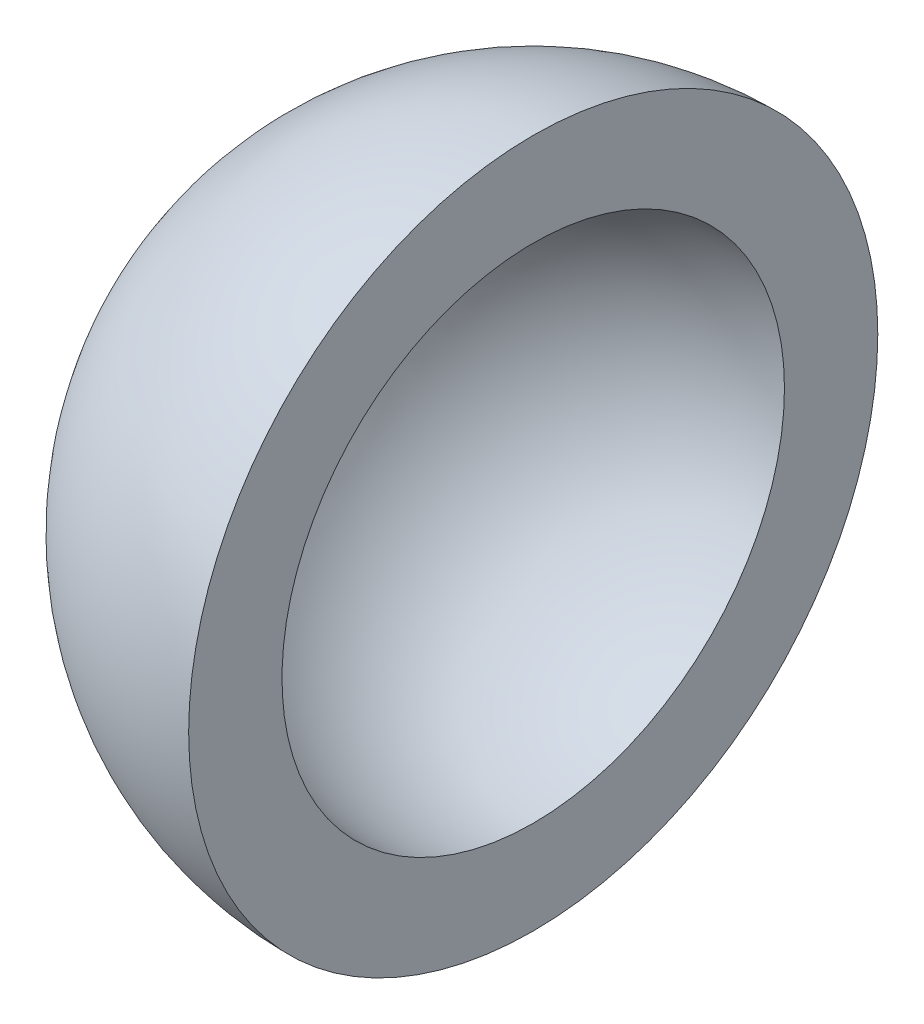
ISO-10303-21;
HEADER;
FILE_DESCRIPTION(('STEP AP214'),'2;1');
FILE_NAME('part.step','',(''),(''),'','','');
FILE_SCHEMA(('AUTOMOTIVE_DESIGN { 1 0 10303 214 1 1 1 1 }'));
ENDSEC;
DATA;
#1=APPLICATION_CONTEXT('core data for automotive mechanical design processes');
#2=APPLICATION_PROTOCOL_DEFINITION('international standard','automotive_design',2000,#1);
#3=PRODUCT_CONTEXT('',#1,'mechanical');
#4=PRODUCT('Part','Part','',(#3));
#5=PRODUCT_RELATED_PRODUCT_CATEGORY('part','',(#4));
#6=PRODUCT_DEFINITION_FORMATION('','',#4);
#7=PRODUCT_DEFINITION_CONTEXT('part definition',#1,'design');
#8=PRODUCT_DEFINITION('design','',#6,#7);
#9=PRODUCT_DEFINITION_SHAPE('','',#8);
#10=(LENGTH_UNIT() NAMED_UNIT(*) SI_UNIT(.MILLI.,.METRE.));
#11=(NAMED_UNIT(*) PLANE_ANGLE_UNIT() SI_UNIT($,.RADIAN.));
#12=(NAMED_UNIT(*) SI_UNIT($,.STERADIAN.) SOLID_ANGLE_UNIT());
#13=UNCERTAINTY_MEASURE_WITH_UNIT(LENGTH_MEASURE(1.E-05),#10,'distance_accuracy_value','');
#14=(GEOMETRIC_REPRESENTATION_CONTEXT(3) GLOBAL_UNCERTAINTY_ASSIGNED_CONTEXT((#13)) GLOBAL_UNIT_ASSIGNED_CONTEXT((#10,
#11,#12)) REPRESENTATION_CONTEXT('',''));
#15=CARTESIAN_POINT('',(0.,0.,0.));
#16=DIRECTION('',(0.,0.,1.));
#17=DIRECTION('',(1.,0.,0.));
#18=AXIS2_PLACEMENT_3D('',#15,#16,#17);
#19=CARTESIAN_POINT('',(0.,0.,0.));
#20=DIRECTION('',(1.,0.,0.));
#21=DIRECTION('',(0.,-1.,0.));
#22=AXIS2_PLACEMENT_3D('',#19,#20,#21);
#23=SPHERICAL_SURFACE('',#22,4.23658525158868);
#24=CARTESIAN_POINT('',(0.,0.,0.));
#25=DIRECTION('',(1.,0.,0.));
#26=DIRECTION('',(0.,0.,-1.));
#27=AXIS2_PLACEMENT_3D('',#24,#25,#26);
#28=CIRCLE('',#27,4.23658525158868);
#29=CARTESIAN_POINT('',(0.,0.,-4.23658525158868));
#30=VERTEX_POINT('',#29);
#31=EDGE_CURVE('E36',#30,#30,#28,.T.);
#32=ORIENTED_EDGE('',*,*,#31,.T.);
#33=EDGE_LOOP('',(#32));
#34=FACE_BOUND('',#33,.T.);
#35=ADVANCED_FACE('F30',(#34),#23,.F.);
#36=CARTESIAN_POINT('',(0.,0.,0.));
#37=DIRECTION('',(1.,0.,0.));
#38=DIRECTION('',(0.,1.,0.));
#39=AXIS2_PLACEMENT_3D('',#36,#37,#38);
#40=SPHERICAL_SURFACE('',#39,5.81043940736201);
#41=CARTESIAN_POINT('',(0.,0.,0.));
#42=DIRECTION('',(1.,0.,0.));
#43=DIRECTION('',(0.,0.,-1.));
#44=AXIS2_PLACEMENT_3D('',#41,#42,#43);
#45=CIRCLE('',#44,5.81043940736201);
#46=CARTESIAN_POINT('',(0.,0.,-5.81043940736201));
#47=VERTEX_POINT('',#46);
#48=EDGE_CURVE('E10',#47,#47,#45,.T.);
#49=ORIENTED_EDGE('',*,*,#48,.F.);
#50=EDGE_LOOP('',(#49));
#51=FACE_BOUND('',#50,.T.);
#52=ADVANCED_FACE('F45',(#51),#40,.T.);
#53=CARTESIAN_POINT('',(0.,-4.23658525158868,0.));
#54=DIRECTION('',(-1.,0.,0.));
#55=DIRECTION('',(0.,0.,1.));
#56=AXIS2_PLACEMENT_3D('',#53,#54,#55);
#57=PLANE('',#56);
#58=ORIENTED_EDGE('',*,*,#31,.F.);
#59=EDGE_LOOP('',(#58));
#60=FACE_BOUND('',#59,.T.);
#61=ORIENTED_EDGE('',*,*,#48,.T.);
#62=EDGE_LOOP('',(#61));
#63=FACE_BOUND('',#62,.T.);
#64=ADVANCED_FACE('F43',(#60,#63),#57,.F.);
#65=CLOSED_SHELL('',(#35,#52,#64));
#66=MANIFOLD_SOLID_BREP('B2',#65);
#67=ADVANCED_BREP_SHAPE_REPRESENTATION('',(#18,#66),#14);
#68=SHAPE_DEFINITION_REPRESENTATION(#9,#67);
ENDSEC;
END-ISO-10303-21;
